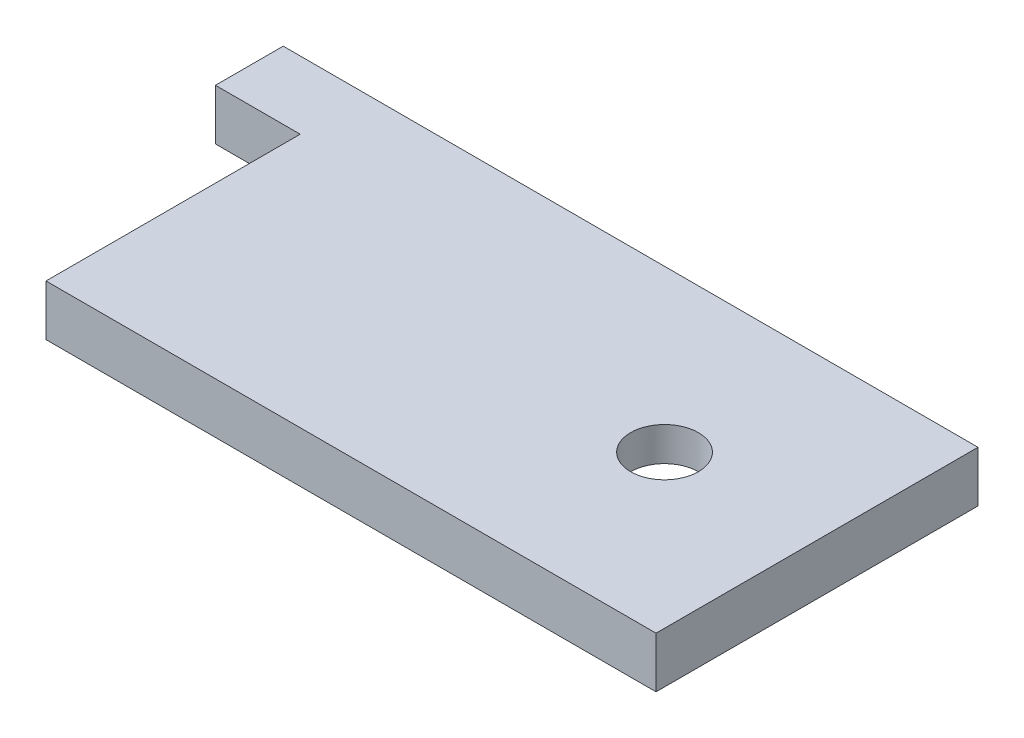
ISO-10303-21;
HEADER;
FILE_DESCRIPTION(('STEP AP214'),'2;1');
FILE_NAME('part.step','',(''),(''),'','','');
FILE_SCHEMA(('AUTOMOTIVE_DESIGN { 1 0 10303 214 1 1 1 1 }'));
ENDSEC;
DATA;
#1=APPLICATION_CONTEXT('core data for automotive mechanical design processes');
#2=APPLICATION_PROTOCOL_DEFINITION('international standard','automotive_design',2000,#1);
#3=PRODUCT_CONTEXT('',#1,'mechanical');
#4=PRODUCT('Part','Part','',(#3));
#5=PRODUCT_RELATED_PRODUCT_CATEGORY('part','',(#4));
#6=PRODUCT_DEFINITION_FORMATION('','',#4);
#7=PRODUCT_DEFINITION_CONTEXT('part definition',#1,'design');
#8=PRODUCT_DEFINITION('design','',#6,#7);
#9=PRODUCT_DEFINITION_SHAPE('','',#8);
#10=(LENGTH_UNIT() NAMED_UNIT(*) SI_UNIT(.MILLI.,.METRE.));
#11=(NAMED_UNIT(*) PLANE_ANGLE_UNIT() SI_UNIT($,.RADIAN.));
#12=(NAMED_UNIT(*) SI_UNIT($,.STERADIAN.) SOLID_ANGLE_UNIT());
#13=UNCERTAINTY_MEASURE_WITH_UNIT(LENGTH_MEASURE(1.E-05),#10,'distance_accuracy_value','');
#14=(GEOMETRIC_REPRESENTATION_CONTEXT(3) GLOBAL_UNCERTAINTY_ASSIGNED_CONTEXT((#13)) GLOBAL_UNIT_ASSIGNED_CONTEXT((#10,
#11,#12)) REPRESENTATION_CONTEXT('',''));
#15=CARTESIAN_POINT('',(0.,0.,0.));
#16=DIRECTION('',(0.,0.,1.));
#17=DIRECTION('',(1.,0.,0.));
#18=AXIS2_PLACEMENT_3D('',#15,#16,#17);
#19=CARTESIAN_POINT('',(0.,0.,19.));
#20=DIRECTION('',(1.,0.,0.));
#21=DIRECTION('',(0.,0.,-1.));
#22=AXIS2_PLACEMENT_3D('',#19,#20,#21);
#23=PLANE('',#22);
#24=DIRECTION('',(0.,1.,0.));
#25=VECTOR('',#24,1.);
#26=CARTESIAN_POINT('',(0.,3.,4.));
#27=LINE('',#26,#25);
#28=CARTESIAN_POINT('',(0.,0.,4.));
#29=VERTEX_POINT('',#28);
#30=CARTESIAN_POINT('',(0.,3.,4.));
#31=VERTEX_POINT('',#30);
#32=EDGE_CURVE('E48',#29,#31,#27,.T.);
#33=ORIENTED_EDGE('',*,*,#32,.F.);
#34=DIRECTION('',(0.,0.,-1.));
#35=VECTOR('',#34,1.);
#36=CARTESIAN_POINT('',(0.,0.,19.));
#37=LINE('',#36,#35);
#38=CARTESIAN_POINT('',(0.,0.,19.));
#39=VERTEX_POINT('',#38);
#40=EDGE_CURVE('E188',#39,#29,#37,.T.);
#41=ORIENTED_EDGE('',*,*,#40,.F.);
#42=DIRECTION('',(0.,-1.,0.));
#43=VECTOR('',#42,1.);
#44=CARTESIAN_POINT('',(0.,0.,19.));
#45=LINE('',#44,#43);
#46=CARTESIAN_POINT('',(0.,3.,19.));
#47=VERTEX_POINT('',#46);
#48=EDGE_CURVE('E187',#47,#39,#45,.T.);
#49=ORIENTED_EDGE('',*,*,#48,.F.);
#50=DIRECTION('',(0.,0.,1.));
#51=VECTOR('',#50,1.);
#52=CARTESIAN_POINT('',(0.,3.,4.));
#53=LINE('',#52,#51);
#54=EDGE_CURVE('E121',#31,#47,#53,.T.);
#55=ORIENTED_EDGE('',*,*,#54,.F.);
#56=EDGE_LOOP('',(#33,#41,#49,#55));
#57=FACE_BOUND('',#56,.T.);
#58=ADVANCED_FACE('F33',(#57),#23,.F.);
#59=CARTESIAN_POINT('',(36.,0.,19.));
#60=DIRECTION('',(0.,1.,0.));
#61=DIRECTION('',(-1.,0.,0.));
#62=AXIS2_PLACEMENT_3D('',#59,#60,#61);
#63=PLANE('',#62);
#64=DIRECTION('',(1.,0.,0.));
#65=VECTOR('',#64,1.);
#66=CARTESIAN_POINT('',(2.,0.,2.));
#67=LINE('',#66,#65);
#68=CARTESIAN_POINT('',(2.,0.,2.));
#69=VERTEX_POINT('',#68);
#70=CARTESIAN_POINT('',(34.,0.,2.));
#71=VERTEX_POINT('',#70);
#72=EDGE_CURVE('E162',#69,#71,#67,.T.);
#73=ORIENTED_EDGE('',*,*,#72,.F.);
#74=DIRECTION('',(0.,0.,-1.));
#75=VECTOR('',#74,1.);
#76=CARTESIAN_POINT('',(2.,0.,17.));
#77=LINE('',#76,#75);
#78=CARTESIAN_POINT('',(2.,0.,17.));
#79=VERTEX_POINT('',#78);
#80=EDGE_CURVE('E56',#79,#69,#77,.T.);
#81=ORIENTED_EDGE('',*,*,#80,.F.);
#82=DIRECTION('',(-1.,0.,0.));
#83=VECTOR('',#82,1.);
#84=CARTESIAN_POINT('',(2.,0.,17.));
#85=LINE('',#84,#83);
#86=CARTESIAN_POINT('',(34.,0.,17.));
#87=VERTEX_POINT('',#86);
#88=EDGE_CURVE('E151',#87,#79,#85,.T.);
#89=ORIENTED_EDGE('',*,*,#88,.F.);
#90=DIRECTION('',(0.,0.,1.));
#91=VECTOR('',#90,1.);
#92=CARTESIAN_POINT('',(34.,0.,17.));
#93=LINE('',#92,#91);
#94=EDGE_CURVE('E165',#71,#87,#93,.T.);
#95=ORIENTED_EDGE('',*,*,#94,.F.);
#96=EDGE_LOOP('',(#73,#81,#89,#95));
#97=FACE_BOUND('',#96,.T.);
#98=DIRECTION('',(1.,0.,0.));
#99=VECTOR('',#98,1.);
#100=CARTESIAN_POINT('',(36.,0.,0.));
#101=LINE('',#100,#99);
#102=CARTESIAN_POINT('',(-5.,0.,0.));
#103=VERTEX_POINT('',#102);
#104=CARTESIAN_POINT('',(36.,0.,0.));
#105=VERTEX_POINT('',#104);
#106=EDGE_CURVE('E111',#103,#105,#101,.T.);
#107=ORIENTED_EDGE('',*,*,#106,.T.);
#108=DIRECTION('',(0.,0.,-1.));
#109=VECTOR('',#108,1.);
#110=CARTESIAN_POINT('',(36.,0.,19.));
#111=LINE('',#110,#109);
#112=CARTESIAN_POINT('',(36.,0.,19.));
#113=VERTEX_POINT('',#112);
#114=EDGE_CURVE('E11',#113,#105,#111,.T.);
#115=ORIENTED_EDGE('',*,*,#114,.F.);
#116=DIRECTION('',(1.,0.,0.));
#117=VECTOR('',#116,1.);
#118=CARTESIAN_POINT('',(36.,0.,19.));
#119=LINE('',#118,#117);
#120=EDGE_CURVE('E178',#39,#113,#119,.T.);
#121=ORIENTED_EDGE('',*,*,#120,.F.);
#122=ORIENTED_EDGE('',*,*,#40,.T.);
#123=DIRECTION('',(1.,0.,0.));
#124=VECTOR('',#123,1.);
#125=CARTESIAN_POINT('',(-5.,0.,4.));
#126=LINE('',#125,#124);
#127=CARTESIAN_POINT('',(-5.,0.,4.));
#128=VERTEX_POINT('',#127);
#129=EDGE_CURVE('E126',#128,#29,#126,.T.);
#130=ORIENTED_EDGE('',*,*,#129,.F.);
#131=DIRECTION('',(0.,0.,1.));
#132=VECTOR('',#131,1.);
#133=CARTESIAN_POINT('',(-5.,0.,0.));
#134=LINE('',#133,#132);
#135=EDGE_CURVE('E124',#103,#128,#134,.T.);
#136=ORIENTED_EDGE('',*,*,#135,.F.);
#137=EDGE_LOOP('',(#107,#115,#121,#122,#130,#136));
#138=FACE_BOUND('',#137,.T.);
#139=ADVANCED_FACE('F35',(#97,#138),#63,.F.);
#140=CARTESIAN_POINT('',(36.,3.,19.));
#141=DIRECTION('',(-1.,0.,0.));
#142=DIRECTION('',(0.,0.,1.));
#143=AXIS2_PLACEMENT_3D('',#140,#141,#142);
#144=PLANE('',#143);
#145=DIRECTION('',(0.,1.,0.));
#146=VECTOR('',#145,1.);
#147=CARTESIAN_POINT('',(36.,3.,0.));
#148=LINE('',#147,#146);
#149=CARTESIAN_POINT('',(36.,3.,0.));
#150=VERTEX_POINT('',#149);
#151=EDGE_CURVE('E118',#105,#150,#148,.T.);
#152=ORIENTED_EDGE('',*,*,#151,.T.);
#153=DIRECTION('',(0.,0.,-1.));
#154=VECTOR('',#153,1.);
#155=CARTESIAN_POINT('',(36.,3.,19.));
#156=LINE('',#155,#154);
#157=CARTESIAN_POINT('',(36.,3.,19.));
#158=VERTEX_POINT('',#157);
#159=EDGE_CURVE('E41',#158,#150,#156,.T.);
#160=ORIENTED_EDGE('',*,*,#159,.F.);
#161=DIRECTION('',(0.,1.,0.));
#162=VECTOR('',#161,1.);
#163=CARTESIAN_POINT('',(36.,3.,19.));
#164=LINE('',#163,#162);
#165=EDGE_CURVE('E181',#113,#158,#164,.T.);
#166=ORIENTED_EDGE('',*,*,#165,.F.);
#167=ORIENTED_EDGE('',*,*,#114,.T.);
#168=EDGE_LOOP('',(#152,#160,#166,#167));
#169=FACE_BOUND('',#168,.T.);
#170=ADVANCED_FACE('F197',(#169),#144,.F.);
#171=CARTESIAN_POINT('',(4.,3.,19.));
#172=DIRECTION('',(0.,-1.,0.));
#173=DIRECTION('',(0.,0.,-1.));
#174=AXIS2_PLACEMENT_3D('',#171,#172,#173);
#175=PLANE('',#174);
#176=CARTESIAN_POINT('',(27.,3.,9.5));
#177=DIRECTION('',(0.,-1.,0.));
#178=DIRECTION('',(0.,0.,-1.));
#179=AXIS2_PLACEMENT_3D('',#176,#177,#178);
#180=CIRCLE('',#179,2.);
#181=CARTESIAN_POINT('',(27.,3.,7.5));
#182=VERTEX_POINT('',#181);
#183=EDGE_CURVE('E136',#182,#182,#180,.T.);
#184=ORIENTED_EDGE('',*,*,#183,.T.);
#185=EDGE_LOOP('',(#184));
#186=FACE_BOUND('',#185,.T.);
#187=DIRECTION('',(-1.,0.,0.));
#188=VECTOR('',#187,1.);
#189=CARTESIAN_POINT('',(4.,3.,0.));
#190=LINE('',#189,#188);
#191=CARTESIAN_POINT('',(-5.,3.,0.));
#192=VERTEX_POINT('',#191);
#193=EDGE_CURVE('E182',#150,#192,#190,.T.);
#194=ORIENTED_EDGE('',*,*,#193,.T.);
#195=DIRECTION('',(0.,0.,-1.));
#196=VECTOR('',#195,1.);
#197=CARTESIAN_POINT('',(-5.,3.,0.));
#198=LINE('',#197,#196);
#199=CARTESIAN_POINT('',(-5.,3.,4.));
#200=VERTEX_POINT('',#199);
#201=EDGE_CURVE('E134',#200,#192,#198,.T.);
#202=ORIENTED_EDGE('',*,*,#201,.F.);
#203=DIRECTION('',(1.,0.,0.));
#204=VECTOR('',#203,1.);
#205=CARTESIAN_POINT('',(-5.,3.,4.));
#206=LINE('',#205,#204);
#207=EDGE_CURVE('E142',#200,#31,#206,.T.);
#208=ORIENTED_EDGE('',*,*,#207,.T.);
#209=ORIENTED_EDGE('',*,*,#54,.T.);
#210=DIRECTION('',(-1.,0.,0.));
#211=VECTOR('',#210,1.);
#212=CARTESIAN_POINT('',(4.,3.,19.));
#213=LINE('',#212,#211);
#214=EDGE_CURVE('E184',#158,#47,#213,.T.);
#215=ORIENTED_EDGE('',*,*,#214,.F.);
#216=ORIENTED_EDGE('',*,*,#159,.T.);
#217=EDGE_LOOP('',(#194,#202,#208,#209,#215,#216));
#218=FACE_BOUND('',#217,.T.);
#219=ADVANCED_FACE('F195',(#186,#218),#175,.F.);
#220=CARTESIAN_POINT('',(0.,0.,19.));
#221=DIRECTION('',(0.,0.,-1.));
#222=DIRECTION('',(-1.,0.,0.));
#223=AXIS2_PLACEMENT_3D('',#220,#221,#222);
#224=PLANE('',#223);
#225=ORIENTED_EDGE('',*,*,#214,.T.);
#226=ORIENTED_EDGE('',*,*,#48,.T.);
#227=ORIENTED_EDGE('',*,*,#120,.T.);
#228=ORIENTED_EDGE('',*,*,#165,.T.);
#229=EDGE_LOOP('',(#225,#226,#227,#228));
#230=FACE_BOUND('',#229,.T.);
#231=ADVANCED_FACE('F200',(#230),#224,.F.);
#232=CARTESIAN_POINT('',(0.,0.,0.));
#233=DIRECTION('',(0.,0.,-1.));
#234=DIRECTION('',(-1.,0.,0.));
#235=AXIS2_PLACEMENT_3D('',#232,#233,#234);
#236=PLANE('',#235);
#237=ORIENTED_EDGE('',*,*,#106,.F.);
#238=DIRECTION('',(0.,-1.,0.));
#239=VECTOR('',#238,1.);
#240=CARTESIAN_POINT('',(-5.,3.,0.));
#241=LINE('',#240,#239);
#242=EDGE_CURVE('E116',#192,#103,#241,.T.);
#243=ORIENTED_EDGE('',*,*,#242,.F.);
#244=ORIENTED_EDGE('',*,*,#193,.F.);
#245=ORIENTED_EDGE('',*,*,#151,.F.);
#246=EDGE_LOOP('',(#237,#243,#244,#245));
#247=FACE_BOUND('',#246,.T.);
#248=ADVANCED_FACE('F113',(#247),#236,.T.);
#249=CARTESIAN_POINT('',(2.,1.,17.));
#250=DIRECTION('',(-1.,0.,0.));
#251=DIRECTION('',(0.,0.,1.));
#252=AXIS2_PLACEMENT_3D('',#249,#250,#251);
#253=PLANE('',#252);
#254=ORIENTED_EDGE('',*,*,#80,.T.);
#255=DIRECTION('',(0.,-1.,0.));
#256=VECTOR('',#255,1.);
#257=CARTESIAN_POINT('',(2.,1.,2.));
#258=LINE('',#257,#256);
#259=CARTESIAN_POINT('',(2.,1.,2.));
#260=VERTEX_POINT('',#259);
#261=EDGE_CURVE('E160',#260,#69,#258,.T.);
#262=ORIENTED_EDGE('',*,*,#261,.F.);
#263=DIRECTION('',(0.,0.,-1.));
#264=VECTOR('',#263,1.);
#265=CARTESIAN_POINT('',(2.,1.,17.));
#266=LINE('',#265,#264);
#267=CARTESIAN_POINT('',(2.,1.,17.));
#268=VERTEX_POINT('',#267);
#269=EDGE_CURVE('E147',#268,#260,#266,.T.);
#270=ORIENTED_EDGE('',*,*,#269,.F.);
#271=DIRECTION('',(0.,-1.,0.));
#272=VECTOR('',#271,1.);
#273=CARTESIAN_POINT('',(2.,1.,17.));
#274=LINE('',#273,#272);
#275=EDGE_CURVE('E170',#268,#79,#274,.T.);
#276=ORIENTED_EDGE('',*,*,#275,.T.);
#277=EDGE_LOOP('',(#254,#262,#270,#276));
#278=FACE_BOUND('',#277,.T.);
#279=ADVANCED_FACE('F237',(#278),#253,.F.);
#280=CARTESIAN_POINT('',(2.,1.,17.));
#281=DIRECTION('',(0.,0.,1.));
#282=DIRECTION('',(1.,0.,0.));
#283=AXIS2_PLACEMENT_3D('',#280,#281,#282);
#284=PLANE('',#283);
#285=ORIENTED_EDGE('',*,*,#88,.T.);
#286=ORIENTED_EDGE('',*,*,#275,.F.);
#287=DIRECTION('',(-1.,0.,0.));
#288=VECTOR('',#287,1.);
#289=CARTESIAN_POINT('',(2.,1.,17.));
#290=LINE('',#289,#288);
#291=CARTESIAN_POINT('',(34.,1.,17.));
#292=VERTEX_POINT('',#291);
#293=EDGE_CURVE('E157',#292,#268,#290,.T.);
#294=ORIENTED_EDGE('',*,*,#293,.F.);
#295=DIRECTION('',(0.,-1.,0.));
#296=VECTOR('',#295,1.);
#297=CARTESIAN_POINT('',(34.,1.,17.));
#298=LINE('',#297,#296);
#299=EDGE_CURVE('E172',#292,#87,#298,.T.);
#300=ORIENTED_EDGE('',*,*,#299,.T.);
#301=EDGE_LOOP('',(#285,#286,#294,#300));
#302=FACE_BOUND('',#301,.T.);
#303=ADVANCED_FACE('F243',(#302),#284,.F.);
#304=CARTESIAN_POINT('',(34.,1.,17.));
#305=DIRECTION('',(1.,0.,0.));
#306=DIRECTION('',(0.,1.,0.));
#307=AXIS2_PLACEMENT_3D('',#304,#305,#306);
#308=PLANE('',#307);
#309=ORIENTED_EDGE('',*,*,#94,.T.);
#310=ORIENTED_EDGE('',*,*,#299,.F.);
#311=DIRECTION('',(0.,0.,1.));
#312=VECTOR('',#311,1.);
#313=CARTESIAN_POINT('',(34.,1.,17.));
#314=LINE('',#313,#312);
#315=CARTESIAN_POINT('',(34.,1.,2.));
#316=VERTEX_POINT('',#315);
#317=EDGE_CURVE('E154',#316,#292,#314,.T.);
#318=ORIENTED_EDGE('',*,*,#317,.F.);
#319=DIRECTION('',(0.,-1.,0.));
#320=VECTOR('',#319,1.);
#321=CARTESIAN_POINT('',(34.,1.,2.));
#322=LINE('',#321,#320);
#323=EDGE_CURVE('E174',#316,#71,#322,.T.);
#324=ORIENTED_EDGE('',*,*,#323,.T.);
#325=EDGE_LOOP('',(#309,#310,#318,#324));
#326=FACE_BOUND('',#325,.T.);
#327=ADVANCED_FACE('F250',(#326),#308,.F.);
#328=CARTESIAN_POINT('',(2.,1.,2.));
#329=DIRECTION('',(0.,0.,-1.));
#330=DIRECTION('',(-1.,0.,0.));
#331=AXIS2_PLACEMENT_3D('',#328,#329,#330);
#332=PLANE('',#331);
#333=ORIENTED_EDGE('',*,*,#72,.T.);
#334=ORIENTED_EDGE('',*,*,#323,.F.);
#335=DIRECTION('',(1.,0.,0.));
#336=VECTOR('',#335,1.);
#337=CARTESIAN_POINT('',(2.,1.,2.));
#338=LINE('',#337,#336);
#339=EDGE_CURVE('E150',#260,#316,#338,.T.);
#340=ORIENTED_EDGE('',*,*,#339,.F.);
#341=ORIENTED_EDGE('',*,*,#261,.T.);
#342=EDGE_LOOP('',(#333,#334,#340,#341));
#343=FACE_BOUND('',#342,.T.);
#344=ADVANCED_FACE('F258',(#343),#332,.F.);
#345=CARTESIAN_POINT('',(0.,1.,0.));
#346=DIRECTION('',(0.,-1.,0.));
#347=DIRECTION('',(1.,0.,0.));
#348=AXIS2_PLACEMENT_3D('',#345,#346,#347);
#349=PLANE('',#348);
#350=CARTESIAN_POINT('',(27.,1.,9.5));
#351=DIRECTION('',(0.,-1.,0.));
#352=DIRECTION('',(1.,0.,0.));
#353=AXIS2_PLACEMENT_3D('',#350,#351,#352);
#354=CIRCLE('',#353,2.);
#355=CARTESIAN_POINT('',(29.,1.,9.5));
#356=VERTEX_POINT('',#355);
#357=EDGE_CURVE('E345',#356,#356,#354,.T.);
#358=ORIENTED_EDGE('',*,*,#357,.F.);
#359=EDGE_LOOP('',(#358));
#360=FACE_BOUND('',#359,.T.);
#361=ORIENTED_EDGE('',*,*,#269,.T.);
#362=ORIENTED_EDGE('',*,*,#339,.T.);
#363=ORIENTED_EDGE('',*,*,#317,.T.);
#364=ORIENTED_EDGE('',*,*,#293,.T.);
#365=EDGE_LOOP('',(#361,#362,#363,#364));
#366=FACE_BOUND('',#365,.T.);
#367=ADVANCED_FACE('F265',(#360,#366),#349,.T.);
#368=CARTESIAN_POINT('',(-5.,3.,4.));
#369=DIRECTION('',(0.,0.,-1.));
#370=DIRECTION('',(-1.,0.,0.));
#371=AXIS2_PLACEMENT_3D('',#368,#369,#370);
#372=PLANE('',#371);
#373=ORIENTED_EDGE('',*,*,#32,.T.);
#374=ORIENTED_EDGE('',*,*,#207,.F.);
#375=DIRECTION('',(0.,1.,0.));
#376=VECTOR('',#375,1.);
#377=CARTESIAN_POINT('',(-5.,3.,4.));
#378=LINE('',#377,#376);
#379=EDGE_CURVE('E129',#128,#200,#378,.T.);
#380=ORIENTED_EDGE('',*,*,#379,.F.);
#381=ORIENTED_EDGE('',*,*,#129,.T.);
#382=EDGE_LOOP('',(#373,#374,#380,#381));
#383=FACE_BOUND('',#382,.T.);
#384=ADVANCED_FACE('F272',(#383),#372,.F.);
#385=CARTESIAN_POINT('',(-5.,0.,0.));
#386=DIRECTION('',(-1.,0.,0.));
#387=DIRECTION('',(0.,0.,1.));
#388=AXIS2_PLACEMENT_3D('',#385,#386,#387);
#389=PLANE('',#388);
#390=ORIENTED_EDGE('',*,*,#242,.T.);
#391=ORIENTED_EDGE('',*,*,#135,.T.);
#392=ORIENTED_EDGE('',*,*,#379,.T.);
#393=ORIENTED_EDGE('',*,*,#201,.T.);
#394=EDGE_LOOP('',(#390,#391,#392,#393));
#395=FACE_BOUND('',#394,.T.);
#396=ADVANCED_FACE('F132',(#395),#389,.T.);
#397=CARTESIAN_POINT('',(27.,6.,9.5));
#398=DIRECTION('',(0.,-1.,0.));
#399=DIRECTION('',(1.,0.,0.));
#400=AXIS2_PLACEMENT_3D('',#397,#398,#399);
#401=CYLINDRICAL_SURFACE('',#400,2.);
#402=ORIENTED_EDGE('',*,*,#357,.T.);
#403=EDGE_LOOP('',(#402));
#404=FACE_BOUND('',#403,.T.);
#405=ORIENTED_EDGE('',*,*,#183,.F.);
#406=EDGE_LOOP('',(#405));
#407=FACE_BOUND('',#406,.T.);
#408=ADVANCED_FACE('F286',(#404,#407),#401,.F.);
#409=CLOSED_SHELL('',(#58,#139,#170,#219,#231,#248,#279,#303,#327,#344,#367,#384,#396,#408));
#410=MANIFOLD_SOLID_BREP('B2',#409);
#411=ADVANCED_BREP_SHAPE_REPRESENTATION('',(#18,#410),#14);
#412=SHAPE_DEFINITION_REPRESENTATION(#9,#411);
ENDSEC;
END-ISO-10303-21;
